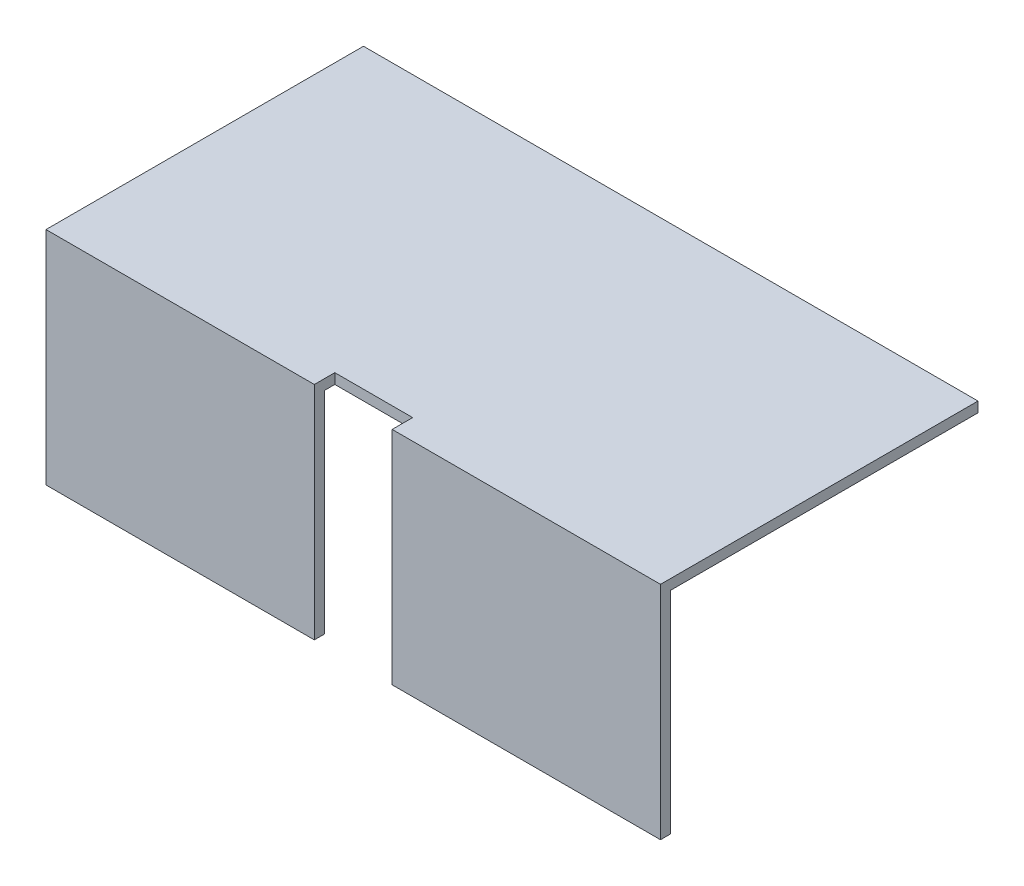
ISO-10303-21;
HEADER;
FILE_DESCRIPTION(('STEP AP214'),'2;1');
FILE_NAME('part.step','',(''),(''),'','','');
FILE_SCHEMA(('AUTOMOTIVE_DESIGN { 1 0 10303 214 1 1 1 1 }'));
ENDSEC;
DATA;
#1=APPLICATION_CONTEXT('core data for automotive mechanical design processes');
#2=APPLICATION_PROTOCOL_DEFINITION('international standard','automotive_design',2000,#1);
#3=PRODUCT_CONTEXT('',#1,'mechanical');
#4=PRODUCT('Part','Part','',(#3));
#5=PRODUCT_RELATED_PRODUCT_CATEGORY('part','',(#4));
#6=PRODUCT_DEFINITION_FORMATION('','',#4);
#7=PRODUCT_DEFINITION_CONTEXT('part definition',#1,'design');
#8=PRODUCT_DEFINITION('design','',#6,#7);
#9=PRODUCT_DEFINITION_SHAPE('','',#8);
#10=(LENGTH_UNIT() NAMED_UNIT(*) SI_UNIT(.MILLI.,.METRE.));
#11=(NAMED_UNIT(*) PLANE_ANGLE_UNIT() SI_UNIT($,.RADIAN.));
#12=(NAMED_UNIT(*) SI_UNIT($,.STERADIAN.) SOLID_ANGLE_UNIT());
#13=UNCERTAINTY_MEASURE_WITH_UNIT(LENGTH_MEASURE(1.E-05),#10,'distance_accuracy_value','');
#14=(GEOMETRIC_REPRESENTATION_CONTEXT(3) GLOBAL_UNCERTAINTY_ASSIGNED_CONTEXT((#13)) GLOBAL_UNIT_ASSIGNED_CONTEXT((#10,
#11,#12)) REPRESENTATION_CONTEXT('',''));
#15=CARTESIAN_POINT('',(0.,0.,0.));
#16=DIRECTION('',(0.,0.,1.));
#17=DIRECTION('',(1.,0.,0.));
#18=AXIS2_PLACEMENT_3D('',#15,#16,#17);
#19=CARTESIAN_POINT('',(300.,0.,155.));
#20=DIRECTION('',(0.,0.,-1.));
#21=DIRECTION('',(0.,1.,0.));
#22=AXIS2_PLACEMENT_3D('',#19,#20,#21);
#23=PLANE('',#22);
#24=DIRECTION('',(-1.,0.,0.));
#25=VECTOR('',#24,1.);
#26=CARTESIAN_POINT('',(300.,-103.,155.));
#27=LINE('',#26,#25);
#28=CARTESIAN_POINT('',(131.,-103.,155.));
#29=VERTEX_POINT('',#28);
#30=CARTESIAN_POINT('',(0.,-103.,155.));
#31=VERTEX_POINT('',#30);
#32=EDGE_CURVE('E40',#29,#31,#27,.T.);
#33=ORIENTED_EDGE('',*,*,#32,.F.);
#34=DIRECTION('',(0.,1.,0.));
#35=VECTOR('',#34,1.);
#36=CARTESIAN_POINT('',(131.,-125.,155.));
#37=LINE('',#36,#35);
#38=CARTESIAN_POINT('',(131.,5.,155.));
#39=VERTEX_POINT('',#38);
#40=EDGE_CURVE('E211',#29,#39,#37,.T.);
#41=ORIENTED_EDGE('',*,*,#40,.T.);
#42=DIRECTION('',(-1.,0.,0.));
#43=VECTOR('',#42,1.);
#44=CARTESIAN_POINT('',(300.,5.,155.));
#45=LINE('',#44,#43);
#46=CARTESIAN_POINT('',(0.,5.,155.));
#47=VERTEX_POINT('',#46);
#48=EDGE_CURVE('E85',#39,#47,#45,.T.);
#49=ORIENTED_EDGE('',*,*,#48,.T.);
#50=DIRECTION('',(0.,-1.,0.));
#51=VECTOR('',#50,1.);
#52=CARTESIAN_POINT('',(0.,0.,155.));
#53=LINE('',#52,#51);
#54=EDGE_CURVE('E130',#47,#31,#53,.T.);
#55=ORIENTED_EDGE('',*,*,#54,.T.);
#56=EDGE_LOOP('',(#33,#41,#49,#55));
#57=FACE_BOUND('',#56,.T.);
#58=ADVANCED_FACE('F32',(#57),#23,.F.);
#59=CARTESIAN_POINT('',(300.,-103.,150.));
#60=DIRECTION('',(0.,-1.,0.));
#61=DIRECTION('',(0.,0.,-1.));
#62=AXIS2_PLACEMENT_3D('',#59,#60,#61);
#63=PLANE('',#62);
#64=DIRECTION('',(0.,0.,-1.));
#65=VECTOR('',#64,1.);
#66=CARTESIAN_POINT('',(131.,-103.,150.));
#67=LINE('',#66,#65);
#68=CARTESIAN_POINT('',(131.,-103.,150.));
#69=VERTEX_POINT('',#68);
#70=EDGE_CURVE('E133',#29,#69,#67,.T.);
#71=ORIENTED_EDGE('',*,*,#70,.F.);
#72=ORIENTED_EDGE('',*,*,#32,.T.);
#73=DIRECTION('',(0.,0.,1.));
#74=VECTOR('',#73,1.);
#75=CARTESIAN_POINT('',(0.,-103.,150.));
#76=LINE('',#75,#74);
#77=CARTESIAN_POINT('',(0.,-103.,150.));
#78=VERTEX_POINT('',#77);
#79=EDGE_CURVE('E132',#78,#31,#76,.T.);
#80=ORIENTED_EDGE('',*,*,#79,.F.);
#81=DIRECTION('',(-1.,0.,0.));
#82=VECTOR('',#81,1.);
#83=CARTESIAN_POINT('',(300.,-103.,150.));
#84=LINE('',#83,#82);
#85=EDGE_CURVE('E149',#69,#78,#84,.T.);
#86=ORIENTED_EDGE('',*,*,#85,.F.);
#87=EDGE_LOOP('',(#71,#72,#80,#86));
#88=FACE_BOUND('',#87,.T.);
#89=ADVANCED_FACE('F166',(#88),#63,.T.);
#90=CARTESIAN_POINT('',(300.,0.,150.));
#91=DIRECTION('',(0.,0.,-1.));
#92=DIRECTION('',(0.,1.,0.));
#93=AXIS2_PLACEMENT_3D('',#90,#91,#92);
#94=PLANE('',#93);
#95=DIRECTION('',(0.,1.,0.));
#96=VECTOR('',#95,1.);
#97=CARTESIAN_POINT('',(131.,0.,150.));
#98=LINE('',#97,#96);
#99=CARTESIAN_POINT('',(131.,0.,150.));
#100=VERTEX_POINT('',#99);
#101=EDGE_CURVE('E163',#69,#100,#98,.T.);
#102=ORIENTED_EDGE('',*,*,#101,.F.);
#103=ORIENTED_EDGE('',*,*,#85,.T.);
#104=DIRECTION('',(0.,-1.,0.));
#105=VECTOR('',#104,1.);
#106=CARTESIAN_POINT('',(0.,0.,150.));
#107=LINE('',#106,#105);
#108=CARTESIAN_POINT('',(0.,0.,150.));
#109=VERTEX_POINT('',#108);
#110=EDGE_CURVE('E136',#109,#78,#107,.T.);
#111=ORIENTED_EDGE('',*,*,#110,.F.);
#112=DIRECTION('',(-1.,0.,0.));
#113=VECTOR('',#112,1.);
#114=CARTESIAN_POINT('',(300.,0.,150.));
#115=LINE('',#114,#113);
#116=EDGE_CURVE('E116',#100,#109,#115,.T.);
#117=ORIENTED_EDGE('',*,*,#116,.F.);
#118=EDGE_LOOP('',(#102,#103,#111,#117));
#119=FACE_BOUND('',#118,.T.);
#120=ADVANCED_FACE('F160',(#119),#94,.T.);
#121=CARTESIAN_POINT('',(300.,5.,155.));
#122=VERTEX_POINT('',#121);
#123=CARTESIAN_POINT('',(169.,5.,155.));
#124=VERTEX_POINT('',#123);
#125=EDGE_CURVE('E144',#122,#124,#45,.T.);
#126=ORIENTED_EDGE('',*,*,#125,.T.);
#127=DIRECTION('',(0.,1.,0.));
#128=VECTOR('',#127,1.);
#129=CARTESIAN_POINT('',(169.,-125.,155.));
#130=LINE('',#129,#128);
#131=CARTESIAN_POINT('',(169.,-103.,155.));
#132=VERTEX_POINT('',#131);
#133=EDGE_CURVE('E47',#132,#124,#130,.T.);
#134=ORIENTED_EDGE('',*,*,#133,.F.);
#135=CARTESIAN_POINT('',(300.,-103.,155.));
#136=VERTEX_POINT('',#135);
#137=EDGE_CURVE('E11',#136,#132,#27,.T.);
#138=ORIENTED_EDGE('',*,*,#137,.F.);
#139=DIRECTION('',(0.,-1.,0.));
#140=VECTOR('',#139,1.);
#141=CARTESIAN_POINT('',(300.,0.,155.));
#142=LINE('',#141,#140);
#143=EDGE_CURVE('E91',#122,#136,#142,.T.);
#144=ORIENTED_EDGE('',*,*,#143,.F.);
#145=EDGE_LOOP('',(#126,#134,#138,#144));
#146=FACE_BOUND('',#145,.T.);
#147=ADVANCED_FACE('F34',(#146),#23,.F.);
#148=DIRECTION('',(0.,0.,1.));
#149=VECTOR('',#148,1.);
#150=CARTESIAN_POINT('',(169.,-103.,150.));
#151=LINE('',#150,#149);
#152=CARTESIAN_POINT('',(169.,-103.,150.));
#153=VERTEX_POINT('',#152);
#154=EDGE_CURVE('E217',#153,#132,#151,.T.);
#155=ORIENTED_EDGE('',*,*,#154,.F.);
#156=CARTESIAN_POINT('',(300.,-103.,150.));
#157=VERTEX_POINT('',#156);
#158=EDGE_CURVE('E150',#157,#153,#84,.T.);
#159=ORIENTED_EDGE('',*,*,#158,.F.);
#160=DIRECTION('',(0.,0.,1.));
#161=VECTOR('',#160,1.);
#162=CARTESIAN_POINT('',(300.,-103.,150.));
#163=LINE('',#162,#161);
#164=EDGE_CURVE('E180',#157,#136,#163,.T.);
#165=ORIENTED_EDGE('',*,*,#164,.T.);
#166=ORIENTED_EDGE('',*,*,#137,.T.);
#167=EDGE_LOOP('',(#155,#159,#165,#166));
#168=FACE_BOUND('',#167,.T.);
#169=ADVANCED_FACE('F256',(#168),#63,.T.);
#170=DIRECTION('',(0.,-1.,0.));
#171=VECTOR('',#170,1.);
#172=CARTESIAN_POINT('',(169.,0.,150.));
#173=LINE('',#172,#171);
#174=CARTESIAN_POINT('',(169.,0.,150.));
#175=VERTEX_POINT('',#174);
#176=EDGE_CURVE('E188',#175,#153,#173,.T.);
#177=ORIENTED_EDGE('',*,*,#176,.F.);
#178=CARTESIAN_POINT('',(300.,0.,150.));
#179=VERTEX_POINT('',#178);
#180=EDGE_CURVE('E148',#179,#175,#115,.T.);
#181=ORIENTED_EDGE('',*,*,#180,.F.);
#182=DIRECTION('',(0.,-1.,0.));
#183=VECTOR('',#182,1.);
#184=CARTESIAN_POINT('',(300.,0.,150.));
#185=LINE('',#184,#183);
#186=EDGE_CURVE('E123',#179,#157,#185,.T.);
#187=ORIENTED_EDGE('',*,*,#186,.T.);
#188=ORIENTED_EDGE('',*,*,#158,.T.);
#189=EDGE_LOOP('',(#177,#181,#187,#188));
#190=FACE_BOUND('',#189,.T.);
#191=ADVANCED_FACE('F185',(#190),#94,.T.);
#192=CARTESIAN_POINT('',(300.,0.,0.));
#193=DIRECTION('',(0.,-1.,0.));
#194=DIRECTION('',(0.,0.,-1.));
#195=AXIS2_PLACEMENT_3D('',#192,#193,#194);
#196=PLANE('',#195);
#197=DIRECTION('',(0.,0.,-1.));
#198=VECTOR('',#197,1.);
#199=CARTESIAN_POINT('',(131.,0.,0.));
#200=LINE('',#199,#198);
#201=CARTESIAN_POINT('',(131.,0.,145.));
#202=VERTEX_POINT('',#201);
#203=EDGE_CURVE('E212',#100,#202,#200,.T.);
#204=ORIENTED_EDGE('',*,*,#203,.F.);
#205=ORIENTED_EDGE('',*,*,#116,.T.);
#206=DIRECTION('',(0.,0.,1.));
#207=VECTOR('',#206,1.);
#208=CARTESIAN_POINT('',(0.,0.,0.));
#209=LINE('',#208,#207);
#210=CARTESIAN_POINT('',(0.,0.,0.));
#211=VERTEX_POINT('',#210);
#212=EDGE_CURVE('E111',#211,#109,#209,.T.);
#213=ORIENTED_EDGE('',*,*,#212,.F.);
#214=DIRECTION('',(-1.,0.,0.));
#215=VECTOR('',#214,1.);
#216=CARTESIAN_POINT('',(300.,0.,0.));
#217=LINE('',#216,#215);
#218=CARTESIAN_POINT('',(300.,0.,0.));
#219=VERTEX_POINT('',#218);
#220=EDGE_CURVE('E104',#219,#211,#217,.T.);
#221=ORIENTED_EDGE('',*,*,#220,.F.);
#222=DIRECTION('',(0.,0.,1.));
#223=VECTOR('',#222,1.);
#224=CARTESIAN_POINT('',(300.,0.,0.));
#225=LINE('',#224,#223);
#226=EDGE_CURVE('E109',#219,#179,#225,.T.);
#227=ORIENTED_EDGE('',*,*,#226,.T.);
#228=ORIENTED_EDGE('',*,*,#180,.T.);
#229=DIRECTION('',(0.,0.,1.));
#230=VECTOR('',#229,1.);
#231=CARTESIAN_POINT('',(169.,0.,-3.63598040564737E-13));
#232=LINE('',#231,#230);
#233=CARTESIAN_POINT('',(169.,0.,145.));
#234=VERTEX_POINT('',#233);
#235=EDGE_CURVE('E193',#234,#175,#232,.T.);
#236=ORIENTED_EDGE('',*,*,#235,.F.);
#237=DIRECTION('',(1.,0.,0.));
#238=VECTOR('',#237,1.);
#239=CARTESIAN_POINT('',(300.,0.,145.));
#240=LINE('',#239,#238);
#241=EDGE_CURVE('E213',#202,#234,#240,.T.);
#242=ORIENTED_EDGE('',*,*,#241,.F.);
#243=EDGE_LOOP('',(#204,#205,#213,#221,#227,#228,#236,#242));
#244=FACE_BOUND('',#243,.T.);
#245=ADVANCED_FACE('F107',(#244),#196,.T.);
#246=CARTESIAN_POINT('',(300.,5.,0.));
#247=DIRECTION('',(0.,0.,-1.));
#248=DIRECTION('',(-1.,0.,0.));
#249=AXIS2_PLACEMENT_3D('',#246,#247,#248);
#250=PLANE('',#249);
#251=DIRECTION('',(0.,-1.,0.));
#252=VECTOR('',#251,1.);
#253=CARTESIAN_POINT('',(0.,5.,0.));
#254=LINE('',#253,#252);
#255=CARTESIAN_POINT('',(0.,5.,0.));
#256=VERTEX_POINT('',#255);
#257=EDGE_CURVE('E140',#256,#211,#254,.T.);
#258=ORIENTED_EDGE('',*,*,#257,.F.);
#259=DIRECTION('',(-1.,0.,0.));
#260=VECTOR('',#259,1.);
#261=CARTESIAN_POINT('',(300.,5.,0.));
#262=LINE('',#261,#260);
#263=CARTESIAN_POINT('',(300.,5.,0.));
#264=VERTEX_POINT('',#263);
#265=EDGE_CURVE('E117',#264,#256,#262,.T.);
#266=ORIENTED_EDGE('',*,*,#265,.F.);
#267=DIRECTION('',(0.,-1.,0.));
#268=VECTOR('',#267,1.);
#269=CARTESIAN_POINT('',(300.,5.,0.));
#270=LINE('',#269,#268);
#271=EDGE_CURVE('E121',#264,#219,#270,.T.);
#272=ORIENTED_EDGE('',*,*,#271,.T.);
#273=ORIENTED_EDGE('',*,*,#220,.T.);
#274=EDGE_LOOP('',(#258,#266,#272,#273));
#275=FACE_BOUND('',#274,.T.);
#276=ADVANCED_FACE('F125',(#275),#250,.T.);
#277=CARTESIAN_POINT('',(300.,5.,0.));
#278=DIRECTION('',(0.,-1.,0.));
#279=DIRECTION('',(0.,0.,-1.));
#280=AXIS2_PLACEMENT_3D('',#277,#278,#279);
#281=PLANE('',#280);
#282=ORIENTED_EDGE('',*,*,#48,.F.);
#283=DIRECTION('',(0.,0.,1.));
#284=VECTOR('',#283,1.);
#285=CARTESIAN_POINT('',(131.,5.,145.));
#286=LINE('',#285,#284);
#287=CARTESIAN_POINT('',(131.,5.,145.));
#288=VERTEX_POINT('',#287);
#289=EDGE_CURVE('E233',#288,#39,#286,.T.);
#290=ORIENTED_EDGE('',*,*,#289,.F.);
#291=DIRECTION('',(-1.,0.,0.));
#292=VECTOR('',#291,1.);
#293=CARTESIAN_POINT('',(131.,5.,145.));
#294=LINE('',#293,#292);
#295=CARTESIAN_POINT('',(169.,5.,145.));
#296=VERTEX_POINT('',#295);
#297=EDGE_CURVE('E223',#296,#288,#294,.T.);
#298=ORIENTED_EDGE('',*,*,#297,.F.);
#299=DIRECTION('',(0.,0.,-1.));
#300=VECTOR('',#299,1.);
#301=CARTESIAN_POINT('',(169.,5.,145.));
#302=LINE('',#301,#300);
#303=EDGE_CURVE('E177',#124,#296,#302,.T.);
#304=ORIENTED_EDGE('',*,*,#303,.F.);
#305=ORIENTED_EDGE('',*,*,#125,.F.);
#306=DIRECTION('',(0.,0.,-1.));
#307=VECTOR('',#306,1.);
#308=CARTESIAN_POINT('',(300.,5.,0.));
#309=LINE('',#308,#307);
#310=EDGE_CURVE('E56',#264,#122,#309,.F.);
#311=ORIENTED_EDGE('',*,*,#310,.F.);
#312=ORIENTED_EDGE('',*,*,#265,.T.);
#313=DIRECTION('',(0.,0.,-1.));
#314=VECTOR('',#313,1.);
#315=CARTESIAN_POINT('',(0.,5.,0.));
#316=LINE('',#315,#314);
#317=EDGE_CURVE('E142',#256,#47,#316,.F.);
#318=ORIENTED_EDGE('',*,*,#317,.T.);
#319=EDGE_LOOP('',(#282,#290,#298,#304,#305,#311,#312,#318));
#320=FACE_BOUND('',#319,.T.);
#321=ADVANCED_FACE('F173',(#320),#281,.F.);
#322=CARTESIAN_POINT('',(300.,0.,0.));
#323=DIRECTION('',(-1.,0.,0.));
#324=DIRECTION('',(0.,0.,1.));
#325=AXIS2_PLACEMENT_3D('',#322,#323,#324);
#326=PLANE('',#325);
#327=ORIENTED_EDGE('',*,*,#143,.T.);
#328=ORIENTED_EDGE('',*,*,#164,.F.);
#329=ORIENTED_EDGE('',*,*,#186,.F.);
#330=ORIENTED_EDGE('',*,*,#226,.F.);
#331=ORIENTED_EDGE('',*,*,#271,.F.);
#332=ORIENTED_EDGE('',*,*,#310,.T.);
#333=EDGE_LOOP('',(#327,#328,#329,#330,#331,#332));
#334=FACE_BOUND('',#333,.T.);
#335=ADVANCED_FACE('F120',(#334),#326,.F.);
#336=CARTESIAN_POINT('',(0.,0.,0.));
#337=DIRECTION('',(-1.,0.,0.));
#338=DIRECTION('',(0.,0.,1.));
#339=AXIS2_PLACEMENT_3D('',#336,#337,#338);
#340=PLANE('',#339);
#341=ORIENTED_EDGE('',*,*,#54,.F.);
#342=ORIENTED_EDGE('',*,*,#317,.F.);
#343=ORIENTED_EDGE('',*,*,#257,.T.);
#344=ORIENTED_EDGE('',*,*,#212,.T.);
#345=ORIENTED_EDGE('',*,*,#110,.T.);
#346=ORIENTED_EDGE('',*,*,#79,.T.);
#347=EDGE_LOOP('',(#341,#342,#343,#344,#345,#346));
#348=FACE_BOUND('',#347,.T.);
#349=ADVANCED_FACE('F170',(#348),#340,.T.);
#350=CARTESIAN_POINT('',(131.,-125.,145.));
#351=DIRECTION('',(-1.,0.,0.));
#352=DIRECTION('',(0.,0.,1.));
#353=AXIS2_PLACEMENT_3D('',#350,#351,#352);
#354=PLANE('',#353);
#355=ORIENTED_EDGE('',*,*,#70,.T.);
#356=ORIENTED_EDGE('',*,*,#101,.T.);
#357=ORIENTED_EDGE('',*,*,#203,.T.);
#358=DIRECTION('',(0.,1.,0.));
#359=VECTOR('',#358,1.);
#360=CARTESIAN_POINT('',(131.,-125.,145.));
#361=LINE('',#360,#359);
#362=EDGE_CURVE('E221',#202,#288,#361,.T.);
#363=ORIENTED_EDGE('',*,*,#362,.T.);
#364=ORIENTED_EDGE('',*,*,#289,.T.);
#365=ORIENTED_EDGE('',*,*,#40,.F.);
#366=EDGE_LOOP('',(#355,#356,#357,#363,#364,#365));
#367=FACE_BOUND('',#366,.T.);
#368=ADVANCED_FACE('F208',(#367),#354,.F.);
#369=CARTESIAN_POINT('',(131.,-125.,145.));
#370=DIRECTION('',(0.,0.,-1.));
#371=DIRECTION('',(-1.,0.,0.));
#372=AXIS2_PLACEMENT_3D('',#369,#370,#371);
#373=PLANE('',#372);
#374=ORIENTED_EDGE('',*,*,#241,.T.);
#375=DIRECTION('',(0.,1.,0.));
#376=VECTOR('',#375,1.);
#377=CARTESIAN_POINT('',(169.,-125.,145.));
#378=LINE('',#377,#376);
#379=EDGE_CURVE('E225',#234,#296,#378,.T.);
#380=ORIENTED_EDGE('',*,*,#379,.T.);
#381=ORIENTED_EDGE('',*,*,#297,.T.);
#382=ORIENTED_EDGE('',*,*,#362,.F.);
#383=EDGE_LOOP('',(#374,#380,#381,#382));
#384=FACE_BOUND('',#383,.T.);
#385=ADVANCED_FACE('F242',(#384),#373,.F.);
#386=CARTESIAN_POINT('',(169.,-125.,145.));
#387=DIRECTION('',(1.,0.,0.));
#388=DIRECTION('',(0.,0.,-1.));
#389=AXIS2_PLACEMENT_3D('',#386,#387,#388);
#390=PLANE('',#389);
#391=ORIENTED_EDGE('',*,*,#154,.T.);
#392=ORIENTED_EDGE('',*,*,#133,.T.);
#393=ORIENTED_EDGE('',*,*,#303,.T.);
#394=ORIENTED_EDGE('',*,*,#379,.F.);
#395=ORIENTED_EDGE('',*,*,#235,.T.);
#396=ORIENTED_EDGE('',*,*,#176,.T.);
#397=EDGE_LOOP('',(#391,#392,#393,#394,#395,#396));
#398=FACE_BOUND('',#397,.T.);
#399=ADVANCED_FACE('F243',(#398),#390,.F.);
#400=CLOSED_SHELL('',(#58,#89,#120,#147,#169,#191,#245,#276,#321,#335,#349,#368,#385,#399));
#401=MANIFOLD_SOLID_BREP('B2',#400);
#402=ADVANCED_BREP_SHAPE_REPRESENTATION('',(#18,#401),#14);
#403=SHAPE_DEFINITION_REPRESENTATION(#9,#402);
ENDSEC;
END-ISO-10303-21;
